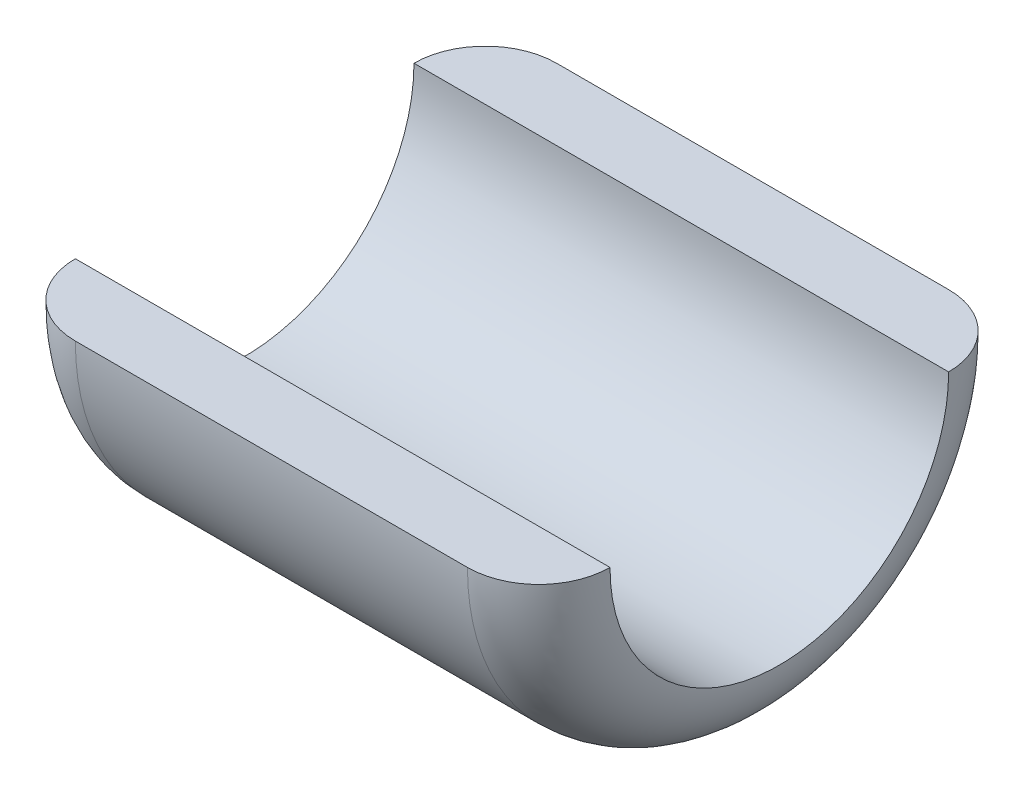
ISO-10303-21;
HEADER;
FILE_DESCRIPTION(('STEP AP214'),'2;1');
FILE_NAME('part.step','',(''),(''),'','','');
FILE_SCHEMA(('AUTOMOTIVE_DESIGN { 1 0 10303 214 1 1 1 1 }'));
ENDSEC;
DATA;
#1=APPLICATION_CONTEXT('core data for automotive mechanical design processes');
#2=APPLICATION_PROTOCOL_DEFINITION('international standard','automotive_design',2000,#1);
#3=PRODUCT_CONTEXT('',#1,'mechanical');
#4=PRODUCT('Part','Part','',(#3));
#5=PRODUCT_RELATED_PRODUCT_CATEGORY('part','',(#4));
#6=PRODUCT_DEFINITION_FORMATION('','',#4);
#7=PRODUCT_DEFINITION_CONTEXT('part definition',#1,'design');
#8=PRODUCT_DEFINITION('design','',#6,#7);
#9=PRODUCT_DEFINITION_SHAPE('','',#8);
#10=(LENGTH_UNIT() NAMED_UNIT(*) SI_UNIT(.MILLI.,.METRE.));
#11=(NAMED_UNIT(*) PLANE_ANGLE_UNIT() SI_UNIT($,.RADIAN.));
#12=(NAMED_UNIT(*) SI_UNIT($,.STERADIAN.) SOLID_ANGLE_UNIT());
#13=UNCERTAINTY_MEASURE_WITH_UNIT(LENGTH_MEASURE(1.E-05),#10,'distance_accuracy_value','');
#14=(GEOMETRIC_REPRESENTATION_CONTEXT(3) GLOBAL_UNCERTAINTY_ASSIGNED_CONTEXT((#13)) GLOBAL_UNIT_ASSIGNED_CONTEXT((#10,
#11,#12)) REPRESENTATION_CONTEXT('',''));
#15=CARTESIAN_POINT('',(0.,0.,0.));
#16=DIRECTION('',(0.,0.,1.));
#17=DIRECTION('',(1.,0.,0.));
#18=AXIS2_PLACEMENT_3D('',#15,#16,#17);
#19=CARTESIAN_POINT('',(-3.,0.,0.));
#20=DIRECTION('',(1.,0.,0.));
#21=DIRECTION('',(0.,1.,0.));
#22=AXIS2_PLACEMENT_3D('',#19,#20,#21);
#23=CYLINDRICAL_SURFACE('',#22,6.75);
#24=DIRECTION('',(-1.,0.,0.));
#25=VECTOR('',#24,1.);
#26=CARTESIAN_POINT('',(12.,0.,-6.75));
#27=LINE('',#26,#25);
#28=CARTESIAN_POINT('',(10.,0.,-6.75));
#29=VERTEX_POINT('',#28);
#30=CARTESIAN_POINT('',(-0.999999999999999,0.,-6.75));
#31=VERTEX_POINT('',#30);
#32=EDGE_CURVE('E59',#29,#31,#27,.T.);
#33=ORIENTED_EDGE('',*,*,#32,.F.);
#34=CARTESIAN_POINT('',(10.,0.,0.));
#35=DIRECTION('',(-1.,0.,0.));
#36=DIRECTION('',(0.,-1.,0.));
#37=AXIS2_PLACEMENT_3D('',#34,#35,#36);
#38=CIRCLE('',#37,6.75);
#39=CARTESIAN_POINT('',(10.,0.,6.75));
#40=VERTEX_POINT('',#39);
#41=EDGE_CURVE('E89',#29,#40,#38,.T.);
#42=ORIENTED_EDGE('',*,*,#41,.T.);
#43=DIRECTION('',(-1.,0.,0.));
#44=VECTOR('',#43,1.);
#45=CARTESIAN_POINT('',(12.,0.,6.75));
#46=LINE('',#45,#44);
#47=CARTESIAN_POINT('',(-0.999999999999999,0.,6.75));
#48=VERTEX_POINT('',#47);
#49=EDGE_CURVE('E102',#40,#48,#46,.T.);
#50=ORIENTED_EDGE('',*,*,#49,.T.);
#51=CARTESIAN_POINT('',(-0.999999999999999,0.,0.));
#52=DIRECTION('',(-1.,0.,0.));
#53=DIRECTION('',(0.,-1.,0.));
#54=AXIS2_PLACEMENT_3D('',#51,#52,#53);
#55=CIRCLE('',#54,6.75);
#56=EDGE_CURVE('E92',#48,#31,#55,.F.);
#57=ORIENTED_EDGE('',*,*,#56,.T.);
#58=EDGE_LOOP('',(#33,#42,#50,#57));
#59=FACE_BOUND('',#58,.T.);
#60=ADVANCED_FACE('F36',(#59),#23,.T.);
#61=CARTESIAN_POINT('',(-3.,0.,0.));
#62=DIRECTION('',(1.,0.,0.));
#63=DIRECTION('',(0.,1.,0.));
#64=AXIS2_PLACEMENT_3D('',#61,#62,#63);
#65=CYLINDRICAL_SURFACE('',#64,4.75);
#66=CARTESIAN_POINT('',(12.,0.,0.));
#67=DIRECTION('',(-1.,0.,0.));
#68=DIRECTION('',(0.,-1.,0.));
#69=AXIS2_PLACEMENT_3D('',#66,#67,#68);
#70=CIRCLE('',#69,4.75);
#71=CARTESIAN_POINT('',(12.,0.,-4.75));
#72=VERTEX_POINT('',#71);
#73=CARTESIAN_POINT('',(12.,0.,4.75));
#74=VERTEX_POINT('',#73);
#75=EDGE_CURVE('E87',#72,#74,#70,.T.);
#76=ORIENTED_EDGE('',*,*,#75,.F.);
#77=DIRECTION('',(-1.,0.,0.));
#78=VECTOR('',#77,1.);
#79=CARTESIAN_POINT('',(12.,0.,-4.75));
#80=LINE('',#79,#78);
#81=CARTESIAN_POINT('',(-3.,0.,-4.75));
#82=VERTEX_POINT('',#81);
#83=EDGE_CURVE('E75',#72,#82,#80,.T.);
#84=ORIENTED_EDGE('',*,*,#83,.T.);
#85=CARTESIAN_POINT('',(-3.,0.,0.));
#86=DIRECTION('',(-1.,0.,0.));
#87=DIRECTION('',(0.,-1.,0.));
#88=AXIS2_PLACEMENT_3D('',#85,#86,#87);
#89=CIRCLE('',#88,4.75);
#90=CARTESIAN_POINT('',(-3.,0.,4.75));
#91=VERTEX_POINT('',#90);
#92=EDGE_CURVE('E85',#82,#91,#89,.T.);
#93=ORIENTED_EDGE('',*,*,#92,.T.);
#94=DIRECTION('',(-1.,0.,0.));
#95=VECTOR('',#94,1.);
#96=CARTESIAN_POINT('',(12.,0.,4.75));
#97=LINE('',#96,#95);
#98=EDGE_CURVE('E51',#74,#91,#97,.T.);
#99=ORIENTED_EDGE('',*,*,#98,.F.);
#100=EDGE_LOOP('',(#76,#84,#93,#99));
#101=FACE_BOUND('',#100,.T.);
#102=ADVANCED_FACE('F84',(#101),#65,.F.);
#103=CARTESIAN_POINT('',(10.,0.,0.));
#104=DIRECTION('',(-1.,0.,0.));
#105=DIRECTION('',(0.,-1.,0.));
#106=AXIS2_PLACEMENT_3D('',#103,#104,#105);
#107=TOROIDAL_SURFACE('',#106,4.75,2.);
#108=ORIENTED_EDGE('',*,*,#41,.F.);
#109=CARTESIAN_POINT('',(10.,0.,-4.75));
#110=DIRECTION('',(0.,1.,0.));
#111=DIRECTION('',(0.,0.,1.));
#112=AXIS2_PLACEMENT_3D('',#109,#110,#111);
#113=CIRCLE('',#112,2.);
#114=EDGE_CURVE('E94',#29,#72,#113,.F.);
#115=ORIENTED_EDGE('',*,*,#114,.T.);
#116=ORIENTED_EDGE('',*,*,#75,.T.);
#117=CARTESIAN_POINT('',(10.,0.,4.75));
#118=DIRECTION('',(0.,1.,0.));
#119=DIRECTION('',(0.,0.,1.));
#120=AXIS2_PLACEMENT_3D('',#117,#118,#119);
#121=CIRCLE('',#120,2.);
#122=EDGE_CURVE('E105',#74,#40,#121,.F.);
#123=ORIENTED_EDGE('',*,*,#122,.T.);
#124=EDGE_LOOP('',(#108,#115,#116,#123));
#125=FACE_BOUND('',#124,.T.);
#126=ADVANCED_FACE('F109',(#125),#107,.T.);
#127=CARTESIAN_POINT('',(-0.999999999999999,0.,0.));
#128=DIRECTION('',(-1.,0.,0.));
#129=DIRECTION('',(0.,-1.,0.));
#130=AXIS2_PLACEMENT_3D('',#127,#128,#129);
#131=TOROIDAL_SURFACE('',#130,4.75,2.);
#132=ORIENTED_EDGE('',*,*,#92,.F.);
#133=CARTESIAN_POINT('',(-0.999999999999999,0.,-4.75));
#134=DIRECTION('',(0.,1.,0.));
#135=DIRECTION('',(0.,0.,1.));
#136=AXIS2_PLACEMENT_3D('',#133,#134,#135);
#137=CIRCLE('',#136,2.);
#138=EDGE_CURVE('E11',#82,#31,#137,.F.);
#139=ORIENTED_EDGE('',*,*,#138,.T.);
#140=ORIENTED_EDGE('',*,*,#56,.F.);
#141=CARTESIAN_POINT('',(-0.999999999999999,0.,4.75));
#142=DIRECTION('',(0.,1.,0.));
#143=DIRECTION('',(0.,0.,1.));
#144=AXIS2_PLACEMENT_3D('',#141,#142,#143);
#145=CIRCLE('',#144,2.);
#146=EDGE_CURVE('E44',#48,#91,#145,.F.);
#147=ORIENTED_EDGE('',*,*,#146,.T.);
#148=EDGE_LOOP('',(#132,#139,#140,#147));
#149=FACE_BOUND('',#148,.T.);
#150=ADVANCED_FACE('F38',(#149),#131,.T.);
#151=CARTESIAN_POINT('',(12.,0.,0.));
#152=DIRECTION('',(0.,1.,0.));
#153=DIRECTION('',(0.,0.,1.));
#154=AXIS2_PLACEMENT_3D('',#151,#152,#153);
#155=PLANE('',#154);
#156=ORIENTED_EDGE('',*,*,#98,.T.);
#157=ORIENTED_EDGE('',*,*,#146,.F.);
#158=ORIENTED_EDGE('',*,*,#49,.F.);
#159=ORIENTED_EDGE('',*,*,#122,.F.);
#160=EDGE_LOOP('',(#156,#157,#158,#159));
#161=FACE_BOUND('',#160,.T.);
#162=ADVANCED_FACE('F115',(#161),#155,.T.);
#163=CARTESIAN_POINT('',(12.,0.,0.));
#164=DIRECTION('',(0.,1.,0.));
#165=DIRECTION('',(0.,0.,1.));
#166=AXIS2_PLACEMENT_3D('',#163,#164,#165);
#167=PLANE('',#166);
#168=ORIENTED_EDGE('',*,*,#32,.T.);
#169=ORIENTED_EDGE('',*,*,#138,.F.);
#170=ORIENTED_EDGE('',*,*,#83,.F.);
#171=ORIENTED_EDGE('',*,*,#114,.F.);
#172=EDGE_LOOP('',(#168,#169,#170,#171));
#173=FACE_BOUND('',#172,.T.);
#174=ADVANCED_FACE('F74',(#173),#167,.T.);
#175=CLOSED_SHELL('',(#60,#102,#126,#150,#162,#174));
#176=MANIFOLD_SOLID_BREP('B2',#175);
#177=ADVANCED_BREP_SHAPE_REPRESENTATION('',(#18,#176),#14);
#178=SHAPE_DEFINITION_REPRESENTATION(#9,#177);
ENDSEC;
END-ISO-10303-21;
